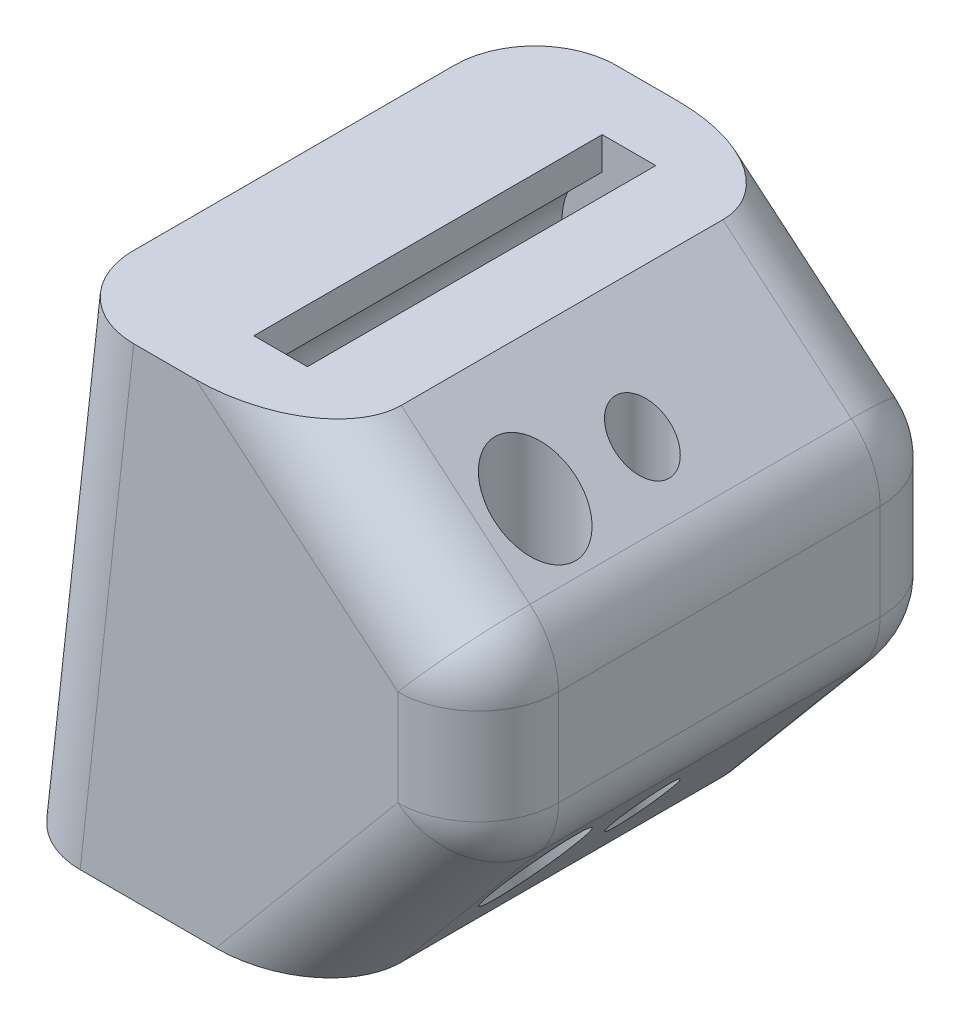
ISO-10303-21;
HEADER;
FILE_DESCRIPTION(('STEP AP214'),'2;1');
FILE_NAME('part.step','',(''),(''),'','','');
FILE_SCHEMA(('AUTOMOTIVE_DESIGN { 1 0 10303 214 1 1 1 1 }'));
ENDSEC;
DATA;
#1=APPLICATION_CONTEXT('core data for automotive mechanical design processes');
#2=APPLICATION_PROTOCOL_DEFINITION('international standard','automotive_design',2000,#1);
#3=PRODUCT_CONTEXT('',#1,'mechanical');
#4=PRODUCT('Part','Part','',(#3));
#5=PRODUCT_RELATED_PRODUCT_CATEGORY('part','',(#4));
#6=PRODUCT_DEFINITION_FORMATION('','',#4);
#7=PRODUCT_DEFINITION_CONTEXT('part definition',#1,'design');
#8=PRODUCT_DEFINITION('design','',#6,#7);
#9=PRODUCT_DEFINITION_SHAPE('','',#8);
#10=(LENGTH_UNIT() NAMED_UNIT(*) SI_UNIT(.MILLI.,.METRE.));
#11=(NAMED_UNIT(*) PLANE_ANGLE_UNIT() SI_UNIT($,.RADIAN.));
#12=(NAMED_UNIT(*) SI_UNIT($,.STERADIAN.) SOLID_ANGLE_UNIT());
#13=UNCERTAINTY_MEASURE_WITH_UNIT(LENGTH_MEASURE(1.E-05),#10,'distance_accuracy_value','');
#14=(GEOMETRIC_REPRESENTATION_CONTEXT(3) GLOBAL_UNCERTAINTY_ASSIGNED_CONTEXT((#13)) GLOBAL_UNIT_ASSIGNED_CONTEXT((#10,
#11,#12)) REPRESENTATION_CONTEXT('',''));
#15=CARTESIAN_POINT('',(0.,0.,0.));
#16=DIRECTION('',(0.,0.,1.));
#17=DIRECTION('',(1.,0.,0.));
#18=AXIS2_PLACEMENT_3D('',#15,#16,#17);
#19=CARTESIAN_POINT('',(0.,0.,18.));
#20=DIRECTION('',(0.,1.,0.));
#21=DIRECTION('',(0.,0.,1.));
#22=AXIS2_PLACEMENT_3D('',#19,#20,#21);
#23=PLANE('',#22);
#24=DIRECTION('',(1.,0.,0.));
#25=VECTOR('',#24,1.);
#26=CARTESIAN_POINT('',(0.,0.,0.));
#27=LINE('',#26,#25);
#28=CARTESIAN_POINT('',(3.01846171271247,0.,0.));
#29=VERTEX_POINT('',#28);
#30=CARTESIAN_POINT('',(8.08377813200317,0.,0.));
#31=VERTEX_POINT('',#30);
#32=EDGE_CURVE('E286',#29,#31,#27,.T.);
#33=ORIENTED_EDGE('',*,*,#32,.T.);
#34=CARTESIAN_POINT('',(8.08377813200317,0.,3.));
#35=DIRECTION('',(0.,1.,0.));
#36=DIRECTION('',(-1.,0.,0.));
#37=AXIS2_PLACEMENT_3D('',#34,#35,#36);
#38=ELLIPSE('',#37,3.91622186799683,3.);
#39=CARTESIAN_POINT('',(12.,0.,3.));
#40=VERTEX_POINT('',#39);
#41=EDGE_CURVE('E382',#31,#40,#38,.F.);
#42=ORIENTED_EDGE('',*,*,#41,.T.);
#43=DIRECTION('',(0.,0.,-1.));
#44=VECTOR('',#43,1.);
#45=CARTESIAN_POINT('',(12.,0.,18.));
#46=LINE('',#45,#44);
#47=CARTESIAN_POINT('',(12.,0.,15.));
#48=VERTEX_POINT('',#47);
#49=EDGE_CURVE('E336',#48,#40,#46,.T.);
#50=ORIENTED_EDGE('',*,*,#49,.F.);
#51=CARTESIAN_POINT('',(8.08377813200318,0.,15.));
#52=DIRECTION('',(0.,1.,0.));
#53=DIRECTION('',(1.,0.,0.));
#54=AXIS2_PLACEMENT_3D('',#51,#52,#53);
#55=ELLIPSE('',#54,3.91622186799683,3.);
#56=CARTESIAN_POINT('',(8.08377813200318,0.,18.));
#57=VERTEX_POINT('',#56);
#58=EDGE_CURVE('E379',#48,#57,#55,.F.);
#59=ORIENTED_EDGE('',*,*,#58,.T.);
#60=DIRECTION('',(1.,0.,0.));
#61=VECTOR('',#60,1.);
#62=CARTESIAN_POINT('',(0.,0.,18.));
#63=LINE('',#62,#61);
#64=CARTESIAN_POINT('',(3.01846171271247,0.,18.));
#65=VERTEX_POINT('',#64);
#66=EDGE_CURVE('E297',#65,#57,#63,.T.);
#67=ORIENTED_EDGE('',*,*,#66,.F.);
#68=CARTESIAN_POINT('',(3.01846171271247,0.,15.));
#69=DIRECTION('',(0.,1.,0.));
#70=DIRECTION('',(-1.,0.,0.));
#71=AXIS2_PLACEMENT_3D('',#68,#69,#70);
#72=ELLIPSE('',#71,3.01846171271247,3.);
#73=CARTESIAN_POINT('',(0.,0.,15.));
#74=VERTEX_POINT('',#73);
#75=EDGE_CURVE('E373',#65,#74,#72,.F.);
#76=ORIENTED_EDGE('',*,*,#75,.T.);
#77=DIRECTION('',(0.,0.,-1.));
#78=VECTOR('',#77,1.);
#79=CARTESIAN_POINT('',(0.,0.,18.));
#80=LINE('',#79,#78);
#81=CARTESIAN_POINT('',(0.,0.,3.));
#82=VERTEX_POINT('',#81);
#83=EDGE_CURVE('E340',#74,#82,#80,.T.);
#84=ORIENTED_EDGE('',*,*,#83,.T.);
#85=CARTESIAN_POINT('',(3.01846171271247,0.,3.));
#86=DIRECTION('',(0.,1.,0.));
#87=DIRECTION('',(1.,0.,0.));
#88=AXIS2_PLACEMENT_3D('',#85,#86,#87);
#89=ELLIPSE('',#88,3.01846171271247,3.);
#90=EDGE_CURVE('E376',#82,#29,#89,.F.);
#91=ORIENTED_EDGE('',*,*,#90,.T.);
#92=EDGE_LOOP('',(#33,#42,#50,#59,#67,#76,#84,#91));
#93=FACE_BOUND('',#92,.T.);
#94=DIRECTION('',(-1.,0.,0.));
#95=VECTOR('',#94,1.);
#96=CARTESIAN_POINT('',(9.,0.,15.5));
#97=LINE('',#96,#95);
#98=CARTESIAN_POINT('',(9.,0.,15.5));
#99=VERTEX_POINT('',#98);
#100=CARTESIAN_POINT('',(7.,0.,15.5));
#101=VERTEX_POINT('',#100);
#102=EDGE_CURVE('E215',#99,#101,#97,.T.);
#103=ORIENTED_EDGE('',*,*,#102,.F.);
#104=DIRECTION('',(0.,0.,-1.));
#105=VECTOR('',#104,1.);
#106=CARTESIAN_POINT('',(9.,0.,15.5));
#107=LINE('',#106,#105);
#108=CARTESIAN_POINT('',(9.,0.,2.5));
#109=VERTEX_POINT('',#108);
#110=EDGE_CURVE('E205',#99,#109,#107,.T.);
#111=ORIENTED_EDGE('',*,*,#110,.T.);
#112=DIRECTION('',(-1.,0.,0.));
#113=VECTOR('',#112,1.);
#114=CARTESIAN_POINT('',(9.,0.,2.5));
#115=LINE('',#114,#113);
#116=CARTESIAN_POINT('',(7.,0.,2.5));
#117=VERTEX_POINT('',#116);
#118=EDGE_CURVE('E224',#109,#117,#115,.T.);
#119=ORIENTED_EDGE('',*,*,#118,.T.);
#120=DIRECTION('',(0.,0.,-1.));
#121=VECTOR('',#120,1.);
#122=CARTESIAN_POINT('',(7.,0.,15.5));
#123=LINE('',#122,#121);
#124=EDGE_CURVE('E246',#101,#117,#123,.T.);
#125=ORIENTED_EDGE('',*,*,#124,.F.);
#126=EDGE_LOOP('',(#103,#111,#119,#125));
#127=FACE_BOUND('',#126,.T.);
#128=ADVANCED_FACE('F39',(#93,#127),#23,.F.);
#129=CARTESIAN_POINT('',(2.,18.,18.));
#130=DIRECTION('',(0.,-1.,0.));
#131=DIRECTION('',(0.,0.,-1.));
#132=AXIS2_PLACEMENT_3D('',#129,#130,#131);
#133=PLANE('',#132);
#134=DIRECTION('',(0.,0.,-1.));
#135=VECTOR('',#134,1.);
#136=CARTESIAN_POINT('',(12.,18.,18.));
#137=LINE('',#136,#135);
#138=CARTESIAN_POINT('',(12.,18.,15.));
#139=VERTEX_POINT('',#138);
#140=CARTESIAN_POINT('',(12.,18.,3.));
#141=VERTEX_POINT('',#140);
#142=EDGE_CURVE('E316',#139,#141,#137,.T.);
#143=ORIENTED_EDGE('',*,*,#142,.T.);
#144=CARTESIAN_POINT('',(7.33282851941877,18.,3.));
#145=DIRECTION('',(0.,-1.,0.));
#146=DIRECTION('',(1.,0.,0.));
#147=AXIS2_PLACEMENT_3D('',#144,#145,#146);
#148=ELLIPSE('',#147,4.66717148058123,3.);
#149=CARTESIAN_POINT('',(7.33282851941877,18.,0.));
#150=VERTEX_POINT('',#149);
#151=EDGE_CURVE('E406',#141,#150,#148,.F.);
#152=ORIENTED_EDGE('',*,*,#151,.T.);
#153=DIRECTION('',(-1.,0.,0.));
#154=VECTOR('',#153,1.);
#155=CARTESIAN_POINT('',(2.,18.,0.));
#156=LINE('',#155,#154);
#157=CARTESIAN_POINT('',(5.01846171271247,18.,0.));
#158=VERTEX_POINT('',#157);
#159=EDGE_CURVE('E302',#150,#158,#156,.T.);
#160=ORIENTED_EDGE('',*,*,#159,.T.);
#161=CARTESIAN_POINT('',(5.01846171271247,18.,3.));
#162=DIRECTION('',(0.,-1.,0.));
#163=DIRECTION('',(1.,0.,0.));
#164=AXIS2_PLACEMENT_3D('',#161,#162,#163);
#165=ELLIPSE('',#164,3.01846171271247,3.);
#166=CARTESIAN_POINT('',(2.,18.,3.));
#167=VERTEX_POINT('',#166);
#168=EDGE_CURVE('E400',#158,#167,#165,.F.);
#169=ORIENTED_EDGE('',*,*,#168,.T.);
#170=DIRECTION('',(0.,0.,-1.));
#171=VECTOR('',#170,1.);
#172=CARTESIAN_POINT('',(2.,18.,18.));
#173=LINE('',#172,#171);
#174=CARTESIAN_POINT('',(2.,18.,15.));
#175=VERTEX_POINT('',#174);
#176=EDGE_CURVE('E306',#175,#167,#173,.T.);
#177=ORIENTED_EDGE('',*,*,#176,.F.);
#178=CARTESIAN_POINT('',(5.01846171271247,18.,15.));
#179=DIRECTION('',(0.,-1.,0.));
#180=DIRECTION('',(-1.,0.,0.));
#181=AXIS2_PLACEMENT_3D('',#178,#179,#180);
#182=ELLIPSE('',#181,3.01846171271247,3.);
#183=CARTESIAN_POINT('',(5.01846171271247,18.,18.));
#184=VERTEX_POINT('',#183);
#185=EDGE_CURVE('E397',#175,#184,#182,.F.);
#186=ORIENTED_EDGE('',*,*,#185,.T.);
#187=DIRECTION('',(-1.,0.,0.));
#188=VECTOR('',#187,1.);
#189=CARTESIAN_POINT('',(2.,18.,18.));
#190=LINE('',#189,#188);
#191=CARTESIAN_POINT('',(7.33282851941876,18.,18.));
#192=VERTEX_POINT('',#191);
#193=EDGE_CURVE('E301',#192,#184,#190,.T.);
#194=ORIENTED_EDGE('',*,*,#193,.F.);
#195=CARTESIAN_POINT('',(7.33282851941876,18.,15.));
#196=DIRECTION('',(0.,-1.,0.));
#197=DIRECTION('',(-1.,0.,0.));
#198=AXIS2_PLACEMENT_3D('',#195,#196,#197);
#199=ELLIPSE('',#198,4.66717148058123,3.);
#200=EDGE_CURVE('E403',#192,#139,#199,.F.);
#201=ORIENTED_EDGE('',*,*,#200,.T.);
#202=EDGE_LOOP('',(#143,#152,#160,#169,#177,#186,#194,#201));
#203=FACE_BOUND('',#202,.T.);
#204=DIRECTION('',(-1.,0.,0.));
#205=VECTOR('',#204,1.);
#206=CARTESIAN_POINT('',(7.,18.,2.5));
#207=LINE('',#206,#205);
#208=CARTESIAN_POINT('',(9.,18.,2.5));
#209=VERTEX_POINT('',#208);
#210=CARTESIAN_POINT('',(7.,18.,2.5));
#211=VERTEX_POINT('',#210);
#212=EDGE_CURVE('E261',#209,#211,#207,.T.);
#213=ORIENTED_EDGE('',*,*,#212,.F.);
#214=DIRECTION('',(0.,0.,1.));
#215=VECTOR('',#214,1.);
#216=CARTESIAN_POINT('',(9.,18.,2.5));
#217=LINE('',#216,#215);
#218=CARTESIAN_POINT('',(9.,18.,15.5));
#219=VERTEX_POINT('',#218);
#220=EDGE_CURVE('E291',#209,#219,#217,.T.);
#221=ORIENTED_EDGE('',*,*,#220,.T.);
#222=DIRECTION('',(-1.,0.,0.));
#223=VECTOR('',#222,1.);
#224=CARTESIAN_POINT('',(7.,18.,15.5));
#225=LINE('',#224,#223);
#226=CARTESIAN_POINT('',(7.,18.,15.5));
#227=VERTEX_POINT('',#226);
#228=EDGE_CURVE('E276',#219,#227,#225,.T.);
#229=ORIENTED_EDGE('',*,*,#228,.T.);
#230=DIRECTION('',(0.,0.,1.));
#231=VECTOR('',#230,1.);
#232=CARTESIAN_POINT('',(7.,18.,2.5));
#233=LINE('',#232,#231);
#234=EDGE_CURVE('E287',#211,#227,#233,.T.);
#235=ORIENTED_EDGE('',*,*,#234,.F.);
#236=EDGE_LOOP('',(#213,#221,#229,#235));
#237=FACE_BOUND('',#236,.T.);
#238=ADVANCED_FACE('F474',(#203,#237),#133,.F.);
#239=CARTESIAN_POINT('',(0.,0.,18.));
#240=DIRECTION('',(0.993883734673619,-0.110431526074846,0.));
#241=DIRECTION('',(0.110431526074846,0.993883734673619,0.));
#242=AXIS2_PLACEMENT_3D('',#239,#240,#241);
#243=PLANE('',#242);
#244=ORIENTED_EDGE('',*,*,#176,.T.);
#245=DIRECTION('',(-0.110431526074846,-0.993883734673619,0.));
#246=VECTOR('',#245,1.);
#247=CARTESIAN_POINT('',(0.,0.,3.));
#248=LINE('',#247,#246);
#249=EDGE_CURVE('E430',#167,#82,#248,.T.);
#250=ORIENTED_EDGE('',*,*,#249,.T.);
#251=ORIENTED_EDGE('',*,*,#83,.F.);
#252=DIRECTION('',(-0.110431526074846,-0.993883734673619,0.));
#253=VECTOR('',#252,1.);
#254=CARTESIAN_POINT('',(0.,0.,15.));
#255=LINE('',#254,#253);
#256=EDGE_CURVE('E427',#74,#175,#255,.F.);
#257=ORIENTED_EDGE('',*,*,#256,.T.);
#258=EDGE_LOOP('',(#244,#250,#251,#257));
#259=FACE_BOUND('',#258,.T.);
#260=ADVANCED_FACE('F508',(#259),#243,.F.);
#261=CARTESIAN_POINT('',(12.,0.,18.));
#262=DIRECTION('',(-0.76604444311898,0.642787609686537,0.));
#263=DIRECTION('',(-0.642787609686537,-0.76604444311898,0.));
#264=AXIS2_PLACEMENT_3D('',#261,#262,#263);
#265=PLANE('',#264);
#266=CARTESIAN_POINT('',(15.,3.57526077778265,9.));
#267=DIRECTION('',(-0.76604444311898,0.642787609686537,0.));
#268=DIRECTION('',(-0.642787609686537,-0.76604444311898,0.));
#269=AXIS2_PLACEMENT_3D('',#266,#267,#268);
#270=ELLIPSE('',#269,1.55572382686042,1.);
#271=CARTESIAN_POINT('',(14.,2.38350718518843,9.));
#272=VERTEX_POINT('',#271);
#273=EDGE_CURVE('E227',#272,#272,#270,.F.);
#274=ORIENTED_EDGE('',*,*,#273,.F.);
#275=EDGE_LOOP('',(#274));
#276=FACE_BOUND('',#275,.T.);
#277=CARTESIAN_POINT('',(15.,3.57526077778265,13.));
#278=DIRECTION('',(-0.76604444311898,0.642787609686537,0.));
#279=DIRECTION('',(-0.642787609686537,-0.76604444311898,0.));
#280=AXIS2_PLACEMENT_3D('',#277,#278,#279);
#281=ELLIPSE('',#280,2.33358574029063,1.5);
#282=CARTESIAN_POINT('',(13.5,1.78763038889132,13.));
#283=VERTEX_POINT('',#282);
#284=EDGE_CURVE('E349',#283,#283,#281,.F.);
#285=ORIENTED_EDGE('',*,*,#284,.F.);
#286=EDGE_LOOP('',(#285));
#287=FACE_BOUND('',#286,.T.);
#288=ORIENTED_EDGE('',*,*,#49,.T.);
#289=DIRECTION('',(0.642787609686537,0.76604444311898,0.));
#290=VECTOR('',#289,1.);
#291=CARTESIAN_POINT('',(17.1718307475979,6.16354787373898,3.));
#292=LINE('',#291,#290);
#293=CARTESIAN_POINT('',(17.1718307475979,6.16354787373898,3.));
#294=VERTEX_POINT('',#293);
#295=EDGE_CURVE('E357',#40,#294,#292,.T.);
#296=ORIENTED_EDGE('',*,*,#295,.T.);
#297=DIRECTION('',(0.,0.,-1.));
#298=VECTOR('',#297,1.);
#299=CARTESIAN_POINT('',(17.1718307475979,6.16354787373898,18.));
#300=LINE('',#299,#298);
#301=CARTESIAN_POINT('',(17.1718307475979,6.16354787373898,15.));
#302=VERTEX_POINT('',#301);
#303=EDGE_CURVE('E332',#302,#294,#300,.T.);
#304=ORIENTED_EDGE('',*,*,#303,.F.);
#305=DIRECTION('',(0.642787609686537,0.76604444311898,0.));
#306=VECTOR('',#305,1.);
#307=CARTESIAN_POINT('',(12.,0.,15.));
#308=LINE('',#307,#306);
#309=EDGE_CURVE('E344',#302,#48,#308,.F.);
#310=ORIENTED_EDGE('',*,*,#309,.T.);
#311=EDGE_LOOP('',(#288,#296,#304,#310));
#312=FACE_BOUND('',#311,.T.);
#313=ADVANCED_FACE('F512',(#276,#287,#312),#265,.F.);
#314=CARTESIAN_POINT('',(14.8736974182409,8.0919107027986,18.));
#315=DIRECTION('',(0.,0.,-1.));
#316=DIRECTION('',(-1.,0.,0.));
#317=AXIS2_PLACEMENT_3D('',#314,#315,#316);
#318=CYLINDRICAL_SURFACE('',#317,3.);
#319=ORIENTED_EDGE('',*,*,#303,.T.);
#320=CARTESIAN_POINT('',(14.8736974182409,8.0919107027986,3.));
#321=DIRECTION('',(0.,0.,-1.));
#322=DIRECTION('',(-1.,0.,0.));
#323=AXIS2_PLACEMENT_3D('',#320,#321,#322);
#324=CIRCLE('',#323,3.);
#325=CARTESIAN_POINT('',(17.8736974182409,8.0919107027986,3.));
#326=VERTEX_POINT('',#325);
#327=EDGE_CURVE('E388',#294,#326,#324,.F.);
#328=ORIENTED_EDGE('',*,*,#327,.T.);
#329=DIRECTION('',(0.,0.,-1.));
#330=VECTOR('',#329,1.);
#331=CARTESIAN_POINT('',(17.8736974182409,8.0919107027986,18.));
#332=LINE('',#331,#330);
#333=CARTESIAN_POINT('',(17.8736974182409,8.0919107027986,15.));
#334=VERTEX_POINT('',#333);
#335=EDGE_CURVE('E328',#334,#326,#332,.T.);
#336=ORIENTED_EDGE('',*,*,#335,.F.);
#337=CARTESIAN_POINT('',(14.8736974182409,8.0919107027986,15.));
#338=DIRECTION('',(0.,0.,-1.));
#339=DIRECTION('',(-1.,0.,0.));
#340=AXIS2_PLACEMENT_3D('',#337,#338,#339);
#341=CIRCLE('',#340,3.);
#342=EDGE_CURVE('E385',#334,#302,#341,.T.);
#343=ORIENTED_EDGE('',*,*,#342,.T.);
#344=EDGE_LOOP('',(#319,#328,#336,#343));
#345=FACE_BOUND('',#344,.T.);
#346=ADVANCED_FACE('F764',(#345),#318,.T.);
#347=CARTESIAN_POINT('',(17.8736974182409,11.6724596882421,18.));
#348=DIRECTION('',(-1.,0.,0.));
#349=DIRECTION('',(0.,-1.,0.));
#350=AXIS2_PLACEMENT_3D('',#347,#348,#349);
#351=PLANE('',#350);
#352=ORIENTED_EDGE('',*,*,#335,.T.);
#353=DIRECTION('',(0.,1.,0.));
#354=VECTOR('',#353,1.);
#355=CARTESIAN_POINT('',(17.8736974182409,11.6724596882421,3.));
#356=LINE('',#355,#354);
#357=CARTESIAN_POINT('',(17.8736974182409,11.6724596882421,3.));
#358=VERTEX_POINT('',#357);
#359=EDGE_CURVE('E11',#326,#358,#356,.T.);
#360=ORIENTED_EDGE('',*,*,#359,.T.);
#361=DIRECTION('',(0.,0.,-1.));
#362=VECTOR('',#361,1.);
#363=CARTESIAN_POINT('',(17.8736974182409,11.6724596882421,18.));
#364=LINE('',#363,#362);
#365=CARTESIAN_POINT('',(17.8736974182409,11.6724596882421,15.));
#366=VERTEX_POINT('',#365);
#367=EDGE_CURVE('E324',#366,#358,#364,.T.);
#368=ORIENTED_EDGE('',*,*,#367,.F.);
#369=DIRECTION('',(0.,1.,0.));
#370=VECTOR('',#369,1.);
#371=CARTESIAN_POINT('',(17.8736974182409,11.6724596882421,15.));
#372=LINE('',#371,#370);
#373=EDGE_CURVE('E49',#366,#334,#372,.F.);
#374=ORIENTED_EDGE('',*,*,#373,.T.);
#375=EDGE_LOOP('',(#352,#360,#368,#374));
#376=FACE_BOUND('',#375,.T.);
#377=ADVANCED_FACE('F755',(#376),#351,.F.);
#378=CARTESIAN_POINT('',(14.8736974182409,11.6724596882421,18.));
#379=DIRECTION('',(0.,0.,-1.));
#380=DIRECTION('',(-1.,0.,0.));
#381=AXIS2_PLACEMENT_3D('',#378,#379,#380);
#382=CYLINDRICAL_SURFACE('',#381,3.);
#383=ORIENTED_EDGE('',*,*,#367,.T.);
#384=CARTESIAN_POINT('',(14.8736974182409,11.6724596882421,3.));
#385=DIRECTION('',(0.,0.,-1.));
#386=DIRECTION('',(-1.,0.,0.));
#387=AXIS2_PLACEMENT_3D('',#384,#385,#386);
#388=CIRCLE('',#387,3.);
#389=CARTESIAN_POINT('',(16.8020602473005,13.970593017599,3.));
#390=VERTEX_POINT('',#389);
#391=EDGE_CURVE('E412',#358,#390,#388,.F.);
#392=ORIENTED_EDGE('',*,*,#391,.T.);
#393=DIRECTION('',(0.,0.,-1.));
#394=VECTOR('',#393,1.);
#395=CARTESIAN_POINT('',(16.8020602473005,13.970593017599,18.));
#396=LINE('',#395,#394);
#397=CARTESIAN_POINT('',(16.8020602473005,13.970593017599,15.));
#398=VERTEX_POINT('',#397);
#399=EDGE_CURVE('E320',#398,#390,#396,.T.);
#400=ORIENTED_EDGE('',*,*,#399,.F.);
#401=CARTESIAN_POINT('',(14.8736974182409,11.6724596882421,15.));
#402=DIRECTION('',(0.,0.,-1.));
#403=DIRECTION('',(-1.,0.,0.));
#404=AXIS2_PLACEMENT_3D('',#401,#402,#403);
#405=CIRCLE('',#404,3.);
#406=EDGE_CURVE('E409',#398,#366,#405,.T.);
#407=ORIENTED_EDGE('',*,*,#406,.T.);
#408=EDGE_LOOP('',(#383,#392,#400,#407));
#409=FACE_BOUND('',#408,.T.);
#410=ADVANCED_FACE('F746',(#409),#382,.T.);
#411=CARTESIAN_POINT('',(12.,18.,18.));
#412=DIRECTION('',(-0.64278760968654,-0.766044443118978,0.));
#413=DIRECTION('',(0.766044443118978,-0.64278760968654,0.));
#414=AXIS2_PLACEMENT_3D('',#411,#412,#413);
#415=PLANE('',#414);
#416=CARTESIAN_POINT('',(15.,15.4827011064682,9.));
#417=DIRECTION('',(-0.64278760968654,-0.766044443118978,0.));
#418=DIRECTION('',(0.766044443118978,-0.64278760968654,0.));
#419=AXIS2_PLACEMENT_3D('',#416,#417,#418);
#420=ELLIPSE('',#419,1.30540728933228,1.);
#421=CARTESIAN_POINT('',(16.,14.6436014752909,9.));
#422=VERTEX_POINT('',#421);
#423=EDGE_CURVE('E351',#422,#422,#420,.F.);
#424=ORIENTED_EDGE('',*,*,#423,.F.);
#425=EDGE_LOOP('',(#424));
#426=FACE_BOUND('',#425,.T.);
#427=CARTESIAN_POINT('',(15.,15.4827011064682,13.));
#428=DIRECTION('',(-0.64278760968654,-0.766044443118978,0.));
#429=DIRECTION('',(0.766044443118978,-0.64278760968654,0.));
#430=AXIS2_PLACEMENT_3D('',#427,#428,#429);
#431=ELLIPSE('',#430,1.95811093399842,1.5);
#432=CARTESIAN_POINT('',(16.5,14.2240516597022,13.));
#433=VERTEX_POINT('',#432);
#434=EDGE_CURVE('E345',#433,#433,#431,.F.);
#435=ORIENTED_EDGE('',*,*,#434,.F.);
#436=EDGE_LOOP('',(#435));
#437=FACE_BOUND('',#436,.T.);
#438=ORIENTED_EDGE('',*,*,#399,.T.);
#439=DIRECTION('',(-0.766044443118978,0.64278760968654,0.));
#440=VECTOR('',#439,1.);
#441=CARTESIAN_POINT('',(12.,18.,3.));
#442=LINE('',#441,#440);
#443=EDGE_CURVE('E394',#390,#141,#442,.T.);
#444=ORIENTED_EDGE('',*,*,#443,.T.);
#445=ORIENTED_EDGE('',*,*,#142,.F.);
#446=DIRECTION('',(-0.766044443118978,0.64278760968654,0.));
#447=VECTOR('',#446,1.);
#448=CARTESIAN_POINT('',(12.,18.,15.));
#449=LINE('',#448,#447);
#450=EDGE_CURVE('E391',#139,#398,#449,.F.);
#451=ORIENTED_EDGE('',*,*,#450,.T.);
#452=EDGE_LOOP('',(#438,#444,#445,#451));
#453=FACE_BOUND('',#452,.T.);
#454=ADVANCED_FACE('F738',(#426,#437,#453),#415,.F.);
#455=CARTESIAN_POINT('',(14.8736974182409,11.6724596882421,18.));
#456=DIRECTION('',(0.,0.,-1.));
#457=DIRECTION('',(-1.,0.,0.));
#458=AXIS2_PLACEMENT_3D('',#455,#456,#457);
#459=PLANE('',#458);
#460=ORIENTED_EDGE('',*,*,#193,.T.);
#461=DIRECTION('',(-0.110431526074846,-0.993883734673619,0.));
#462=VECTOR('',#461,1.);
#463=CARTESIAN_POINT('',(4.44416138222109,12.8312970255776,18.));
#464=LINE('',#463,#462);
#465=EDGE_CURVE('E423',#184,#65,#464,.T.);
#466=ORIENTED_EDGE('',*,*,#465,.T.);
#467=ORIENTED_EDGE('',*,*,#66,.T.);
#468=DIRECTION('',(0.642787609686537,0.76604444311898,0.));
#469=VECTOR('',#468,1.);
#470=CARTESIAN_POINT('',(16.6367736186933,10.1930630987051,18.));
#471=LINE('',#470,#469);
#472=CARTESIAN_POINT('',(14.8736974182409,8.0919107027986,18.));
#473=VERTEX_POINT('',#472);
#474=EDGE_CURVE('E420',#57,#473,#471,.T.);
#475=ORIENTED_EDGE('',*,*,#474,.T.);
#476=DIRECTION('',(0.,1.,0.));
#477=VECTOR('',#476,1.);
#478=CARTESIAN_POINT('',(14.8736974182409,11.6724596882421,18.));
#479=LINE('',#478,#477);
#480=CARTESIAN_POINT('',(14.8736974182409,11.6724596882421,18.));
#481=VERTEX_POINT('',#480);
#482=EDGE_CURVE('E57',#473,#481,#479,.T.);
#483=ORIENTED_EDGE('',*,*,#482,.T.);
#484=DIRECTION('',(-0.766044443118978,0.64278760968654,0.));
#485=VECTOR('',#484,1.);
#486=CARTESIAN_POINT('',(14.8736974182409,11.6724596882421,18.));
#487=LINE('',#486,#485);
#488=EDGE_CURVE('E417',#481,#192,#487,.T.);
#489=ORIENTED_EDGE('',*,*,#488,.T.);
#490=EDGE_LOOP('',(#460,#466,#467,#475,#483,#489));
#491=FACE_BOUND('',#490,.T.);
#492=ADVANCED_FACE('F471',(#491),#459,.F.);
#493=CARTESIAN_POINT('',(14.8736974182409,11.6724596882421,0.));
#494=DIRECTION('',(0.,0.,-1.));
#495=DIRECTION('',(-1.,0.,0.));
#496=AXIS2_PLACEMENT_3D('',#493,#494,#495);
#497=PLANE('',#496);
#498=ORIENTED_EDGE('',*,*,#32,.F.);
#499=DIRECTION('',(-0.110431526074846,-0.993883734673619,0.));
#500=VECTOR('',#499,1.);
#501=CARTESIAN_POINT('',(4.98165120402085,17.6687054217755,0.));
#502=LINE('',#501,#500);
#503=EDGE_CURVE('E370',#29,#158,#502,.F.);
#504=ORIENTED_EDGE('',*,*,#503,.T.);
#505=ORIENTED_EDGE('',*,*,#159,.F.);
#506=DIRECTION('',(-0.766044443118978,0.64278760968654,0.));
#507=VECTOR('',#506,1.);
#508=CARTESIAN_POINT('',(14.8736974182409,11.6724596882421,0.));
#509=LINE('',#508,#507);
#510=CARTESIAN_POINT('',(14.8736974182409,11.6724596882421,0.));
#511=VERTEX_POINT('',#510);
#512=EDGE_CURVE('E364',#150,#511,#509,.F.);
#513=ORIENTED_EDGE('',*,*,#512,.T.);
#514=DIRECTION('',(0.,1.,0.));
#515=VECTOR('',#514,1.);
#516=CARTESIAN_POINT('',(14.8736974182409,8.09191070279861,0.));
#517=LINE('',#516,#515);
#518=CARTESIAN_POINT('',(14.8736974182409,8.0919107027986,0.));
#519=VERTEX_POINT('',#518);
#520=EDGE_CURVE('E361',#511,#519,#517,.F.);
#521=ORIENTED_EDGE('',*,*,#520,.T.);
#522=DIRECTION('',(0.642787609686537,0.76604444311898,0.));
#523=VECTOR('',#522,1.);
#524=CARTESIAN_POINT('',(9.70186667064306,1.92836282905961,0.));
#525=LINE('',#524,#523);
#526=EDGE_CURVE('E367',#519,#31,#525,.F.);
#527=ORIENTED_EDGE('',*,*,#526,.T.);
#528=EDGE_LOOP('',(#498,#504,#505,#513,#521,#527));
#529=FACE_BOUND('',#528,.T.);
#530=ADVANCED_FACE('F717',(#529),#497,.T.);
#531=CARTESIAN_POINT('',(8.,14.5,2.5));
#532=DIRECTION('',(0.,0.,1.));
#533=DIRECTION('',(1.,0.,0.));
#534=AXIS2_PLACEMENT_3D('',#531,#532,#533);
#535=CYLINDRICAL_SURFACE('',#534,2.5);
#536=CARTESIAN_POINT('',(8.,14.5,15.5));
#537=DIRECTION('',(0.,0.,1.));
#538=DIRECTION('',(1.,0.,0.));
#539=AXIS2_PLACEMENT_3D('',#536,#537,#538);
#540=CIRCLE('',#539,2.5);
#541=CARTESIAN_POINT('',(7.,16.7912878474779,15.5));
#542=VERTEX_POINT('',#541);
#543=CARTESIAN_POINT('',(9.,16.7912878474779,15.5));
#544=VERTEX_POINT('',#543);
#545=EDGE_CURVE('E245',#542,#544,#540,.T.);
#546=ORIENTED_EDGE('',*,*,#545,.T.);
#547=DIRECTION('',(0.,0.,1.));
#548=VECTOR('',#547,1.);
#549=CARTESIAN_POINT('',(9.,16.7912878474779,2.5));
#550=LINE('',#549,#548);
#551=CARTESIAN_POINT('',(9.,16.7912878474779,2.5));
#552=VERTEX_POINT('',#551);
#553=EDGE_CURVE('E268',#552,#544,#550,.T.);
#554=ORIENTED_EDGE('',*,*,#553,.F.);
#555=CARTESIAN_POINT('',(8.,14.5,2.5));
#556=DIRECTION('',(0.,0.,1.));
#557=DIRECTION('',(1.,0.,0.));
#558=AXIS2_PLACEMENT_3D('',#555,#556,#557);
#559=CIRCLE('',#558,2.5);
#560=CARTESIAN_POINT('',(7.,16.7912878474779,2.5));
#561=VERTEX_POINT('',#560);
#562=EDGE_CURVE('E252',#561,#552,#559,.T.);
#563=ORIENTED_EDGE('',*,*,#562,.F.);
#564=DIRECTION('',(0.,0.,1.));
#565=VECTOR('',#564,1.);
#566=CARTESIAN_POINT('',(7.,16.7912878474779,2.5));
#567=LINE('',#566,#565);
#568=EDGE_CURVE('E283',#561,#542,#567,.T.);
#569=ORIENTED_EDGE('',*,*,#568,.T.);
#570=EDGE_LOOP('',(#546,#554,#563,#569));
#571=FACE_BOUND('',#570,.T.);
#572=ADVANCED_FACE('F708',(#571),#535,.F.);
#573=CARTESIAN_POINT('',(7.,18.,2.5));
#574=DIRECTION('',(-1.,0.,0.));
#575=DIRECTION('',(0.,-1.,0.));
#576=AXIS2_PLACEMENT_3D('',#573,#574,#575);
#577=PLANE('',#576);
#578=DIRECTION('',(0.,-1.,0.));
#579=VECTOR('',#578,1.);
#580=CARTESIAN_POINT('',(7.,18.,15.5));
#581=LINE('',#580,#579);
#582=EDGE_CURVE('E257',#227,#542,#581,.T.);
#583=ORIENTED_EDGE('',*,*,#582,.T.);
#584=ORIENTED_EDGE('',*,*,#568,.F.);
#585=DIRECTION('',(0.,-1.,0.));
#586=VECTOR('',#585,1.);
#587=CARTESIAN_POINT('',(7.,18.,2.5));
#588=LINE('',#587,#586);
#589=EDGE_CURVE('E264',#211,#561,#588,.T.);
#590=ORIENTED_EDGE('',*,*,#589,.F.);
#591=ORIENTED_EDGE('',*,*,#234,.T.);
#592=EDGE_LOOP('',(#583,#584,#590,#591));
#593=FACE_BOUND('',#592,.T.);
#594=ADVANCED_FACE('F699',(#593),#577,.F.);
#595=CARTESIAN_POINT('',(9.,18.,2.5));
#596=DIRECTION('',(1.,0.,0.));
#597=DIRECTION('',(0.,0.,-1.));
#598=AXIS2_PLACEMENT_3D('',#595,#596,#597);
#599=PLANE('',#598);
#600=DIRECTION('',(0.,1.,0.));
#601=VECTOR('',#600,1.);
#602=CARTESIAN_POINT('',(9.,18.,15.5));
#603=LINE('',#602,#601);
#604=EDGE_CURVE('E272',#544,#219,#603,.T.);
#605=ORIENTED_EDGE('',*,*,#604,.T.);
#606=ORIENTED_EDGE('',*,*,#220,.F.);
#607=DIRECTION('',(0.,1.,0.));
#608=VECTOR('',#607,1.);
#609=CARTESIAN_POINT('',(9.,18.,2.5));
#610=LINE('',#609,#608);
#611=EDGE_CURVE('E256',#552,#209,#610,.T.);
#612=ORIENTED_EDGE('',*,*,#611,.F.);
#613=ORIENTED_EDGE('',*,*,#553,.T.);
#614=EDGE_LOOP('',(#605,#606,#612,#613));
#615=FACE_BOUND('',#614,.T.);
#616=ADVANCED_FACE('F690',(#615),#599,.F.);
#617=CARTESIAN_POINT('',(8.,14.5,2.5));
#618=DIRECTION('',(0.,0.,1.));
#619=DIRECTION('',(1.,0.,0.));
#620=AXIS2_PLACEMENT_3D('',#617,#618,#619);
#621=PLANE('',#620);
#622=ORIENTED_EDGE('',*,*,#562,.T.);
#623=ORIENTED_EDGE('',*,*,#611,.T.);
#624=ORIENTED_EDGE('',*,*,#212,.T.);
#625=ORIENTED_EDGE('',*,*,#589,.T.);
#626=EDGE_LOOP('',(#622,#623,#624,#625));
#627=FACE_BOUND('',#626,.T.);
#628=ADVANCED_FACE('F681',(#627),#621,.T.);
#629=CARTESIAN_POINT('',(8.,14.5,15.5));
#630=DIRECTION('',(0.,0.,1.));
#631=DIRECTION('',(1.,0.,0.));
#632=AXIS2_PLACEMENT_3D('',#629,#630,#631);
#633=PLANE('',#632);
#634=ORIENTED_EDGE('',*,*,#545,.F.);
#635=ORIENTED_EDGE('',*,*,#582,.F.);
#636=ORIENTED_EDGE('',*,*,#228,.F.);
#637=ORIENTED_EDGE('',*,*,#604,.F.);
#638=EDGE_LOOP('',(#634,#635,#636,#637));
#639=FACE_BOUND('',#638,.T.);
#640=ADVANCED_FACE('F668',(#639),#633,.F.);
#641=CARTESIAN_POINT('',(8.,3.5,15.5));
#642=DIRECTION('',(0.,0.,-1.));
#643=DIRECTION('',(-1.,0.,0.));
#644=AXIS2_PLACEMENT_3D('',#641,#642,#643);
#645=CYLINDRICAL_SURFACE('',#644,2.5);
#646=CARTESIAN_POINT('',(8.,3.5,2.5));
#647=DIRECTION('',(0.,0.,-1.));
#648=DIRECTION('',(-1.,0.,0.));
#649=AXIS2_PLACEMENT_3D('',#646,#647,#648);
#650=CIRCLE('',#649,2.5);
#651=CARTESIAN_POINT('',(7.,1.20871215252208,2.5));
#652=VERTEX_POINT('',#651);
#653=CARTESIAN_POINT('',(9.,1.20871215252208,2.5));
#654=VERTEX_POINT('',#653);
#655=EDGE_CURVE('E200',#652,#654,#650,.T.);
#656=ORIENTED_EDGE('',*,*,#655,.T.);
#657=DIRECTION('',(0.,0.,-1.));
#658=VECTOR('',#657,1.);
#659=CARTESIAN_POINT('',(9.,1.20871215252208,15.5));
#660=LINE('',#659,#658);
#661=CARTESIAN_POINT('',(9.,1.20871215252208,15.5));
#662=VERTEX_POINT('',#661);
#663=EDGE_CURVE('E193',#662,#654,#660,.T.);
#664=ORIENTED_EDGE('',*,*,#663,.F.);
#665=CARTESIAN_POINT('',(8.,3.5,15.5));
#666=DIRECTION('',(0.,0.,-1.));
#667=DIRECTION('',(-1.,0.,0.));
#668=AXIS2_PLACEMENT_3D('',#665,#666,#667);
#669=CIRCLE('',#668,2.5);
#670=CARTESIAN_POINT('',(7.,1.20871215252208,15.5));
#671=VERTEX_POINT('',#670);
#672=EDGE_CURVE('E197',#671,#662,#669,.T.);
#673=ORIENTED_EDGE('',*,*,#672,.F.);
#674=DIRECTION('',(0.,0.,-1.));
#675=VECTOR('',#674,1.);
#676=CARTESIAN_POINT('',(7.,1.20871215252208,15.5));
#677=LINE('',#676,#675);
#678=EDGE_CURVE('E242',#671,#652,#677,.T.);
#679=ORIENTED_EDGE('',*,*,#678,.T.);
#680=EDGE_LOOP('',(#656,#664,#673,#679));
#681=FACE_BOUND('',#680,.T.);
#682=ADVANCED_FACE('F195',(#681),#645,.F.);
#683=CARTESIAN_POINT('',(7.,0.,15.5));
#684=DIRECTION('',(-1.,0.,0.));
#685=DIRECTION('',(0.,0.,1.));
#686=AXIS2_PLACEMENT_3D('',#683,#684,#685);
#687=PLANE('',#686);
#688=DIRECTION('',(0.,1.,0.));
#689=VECTOR('',#688,1.);
#690=CARTESIAN_POINT('',(7.,0.,2.5));
#691=LINE('',#690,#689);
#692=EDGE_CURVE('E220',#117,#652,#691,.T.);
#693=ORIENTED_EDGE('',*,*,#692,.T.);
#694=ORIENTED_EDGE('',*,*,#678,.F.);
#695=DIRECTION('',(0.,1.,0.));
#696=VECTOR('',#695,1.);
#697=CARTESIAN_POINT('',(7.,0.,15.5));
#698=LINE('',#697,#696);
#699=EDGE_CURVE('E206',#101,#671,#698,.T.);
#700=ORIENTED_EDGE('',*,*,#699,.F.);
#701=ORIENTED_EDGE('',*,*,#124,.T.);
#702=EDGE_LOOP('',(#693,#694,#700,#701));
#703=FACE_BOUND('',#702,.T.);
#704=ADVANCED_FACE('F652',(#703),#687,.F.);
#705=CARTESIAN_POINT('',(9.,0.,15.5));
#706=DIRECTION('',(1.,0.,0.));
#707=DIRECTION('',(0.,0.,-1.));
#708=AXIS2_PLACEMENT_3D('',#705,#706,#707);
#709=PLANE('',#708);
#710=DIRECTION('',(0.,-1.,0.));
#711=VECTOR('',#710,1.);
#712=CARTESIAN_POINT('',(9.,0.,2.5));
#713=LINE('',#712,#711);
#714=EDGE_CURVE('E236',#654,#109,#713,.T.);
#715=ORIENTED_EDGE('',*,*,#714,.T.);
#716=ORIENTED_EDGE('',*,*,#110,.F.);
#717=DIRECTION('',(0.,-1.,0.));
#718=VECTOR('',#717,1.);
#719=CARTESIAN_POINT('',(9.,0.,15.5));
#720=LINE('',#719,#718);
#721=EDGE_CURVE('E209',#662,#99,#720,.T.);
#722=ORIENTED_EDGE('',*,*,#721,.F.);
#723=ORIENTED_EDGE('',*,*,#663,.T.);
#724=EDGE_LOOP('',(#715,#716,#722,#723));
#725=FACE_BOUND('',#724,.T.);
#726=ADVANCED_FACE('F210',(#725),#709,.F.);
#727=CARTESIAN_POINT('',(8.,3.5,15.5));
#728=DIRECTION('',(0.,0.,-1.));
#729=DIRECTION('',(-1.,0.,0.));
#730=AXIS2_PLACEMENT_3D('',#727,#728,#729);
#731=PLANE('',#730);
#732=ORIENTED_EDGE('',*,*,#672,.T.);
#733=ORIENTED_EDGE('',*,*,#721,.T.);
#734=ORIENTED_EDGE('',*,*,#102,.T.);
#735=ORIENTED_EDGE('',*,*,#699,.T.);
#736=EDGE_LOOP('',(#732,#733,#734,#735));
#737=FACE_BOUND('',#736,.T.);
#738=ADVANCED_FACE('F217',(#737),#731,.T.);
#739=CARTESIAN_POINT('',(8.,3.5,2.5));
#740=DIRECTION('',(0.,0.,-1.));
#741=DIRECTION('',(-1.,0.,0.));
#742=AXIS2_PLACEMENT_3D('',#739,#740,#741);
#743=PLANE('',#742);
#744=ORIENTED_EDGE('',*,*,#655,.F.);
#745=ORIENTED_EDGE('',*,*,#692,.F.);
#746=ORIENTED_EDGE('',*,*,#118,.F.);
#747=ORIENTED_EDGE('',*,*,#714,.F.);
#748=EDGE_LOOP('',(#744,#745,#746,#747));
#749=FACE_BOUND('',#748,.T.);
#750=ADVANCED_FACE('F628',(#749),#743,.F.);
#751=CARTESIAN_POINT('',(15.,25.,13.));
#752=DIRECTION('',(0.,-1.,0.));
#753=DIRECTION('',(0.,0.,-1.));
#754=AXIS2_PLACEMENT_3D('',#751,#752,#753);
#755=CYLINDRICAL_SURFACE('',#754,1.5);
#756=ORIENTED_EDGE('',*,*,#434,.T.);
#757=EDGE_LOOP('',(#756));
#758=FACE_BOUND('',#757,.T.);
#759=ORIENTED_EDGE('',*,*,#284,.T.);
#760=EDGE_LOOP('',(#759));
#761=FACE_BOUND('',#760,.T.);
#762=ADVANCED_FACE('F619',(#758,#761),#755,.F.);
#763=CARTESIAN_POINT('',(15.,25.,9.));
#764=DIRECTION('',(0.,-1.,0.));
#765=DIRECTION('',(0.,0.,-1.));
#766=AXIS2_PLACEMENT_3D('',#763,#764,#765);
#767=CYLINDRICAL_SURFACE('',#766,1.);
#768=ORIENTED_EDGE('',*,*,#423,.T.);
#769=EDGE_LOOP('',(#768));
#770=FACE_BOUND('',#769,.T.);
#771=ORIENTED_EDGE('',*,*,#273,.T.);
#772=EDGE_LOOP('',(#771));
#773=FACE_BOUND('',#772,.T.);
#774=ADVANCED_FACE('F536',(#770,#773),#767,.F.);
#775=CARTESIAN_POINT('',(10.0716371709404,15.7018666706431,3.));
#776=DIRECTION('',(0.766044443118978,-0.64278760968654,0.));
#777=DIRECTION('',(0.64278760968654,0.766044443118978,0.));
#778=AXIS2_PLACEMENT_3D('',#775,#776,#777);
#779=CYLINDRICAL_SURFACE('',#778,3.);
#780=ORIENTED_EDGE('',*,*,#151,.F.);
#781=ORIENTED_EDGE('',*,*,#443,.F.);
#782=CARTESIAN_POINT('',(14.8736974182409,11.6724596882421,3.));
#783=DIRECTION('',(0.766044443118978,-0.64278760968654,0.));
#784=DIRECTION('',(0.64278760968654,0.766044443118978,0.));
#785=AXIS2_PLACEMENT_3D('',#782,#783,#784);
#786=CIRCLE('',#785,3.);
#787=EDGE_CURVE('E350',#511,#390,#786,.T.);
#788=ORIENTED_EDGE('',*,*,#787,.F.);
#789=ORIENTED_EDGE('',*,*,#512,.F.);
#790=EDGE_LOOP('',(#780,#781,#788,#789));
#791=FACE_BOUND('',#790,.T.);
#792=ADVANCED_FACE('F532',(#791),#779,.T.);
#793=CARTESIAN_POINT('',(14.8736974182409,11.6724596882421,3.));
#794=DIRECTION('',(0.,0.,-1.));
#795=DIRECTION('',(-1.,0.,0.));
#796=AXIS2_PLACEMENT_3D('',#793,#794,#795);
#797=SPHERICAL_SURFACE('',#796,3.);
#798=ORIENTED_EDGE('',*,*,#787,.T.);
#799=ORIENTED_EDGE('',*,*,#391,.F.);
#800=CARTESIAN_POINT('',(14.8736974182409,11.6724596882421,3.));
#801=DIRECTION('',(0.,-1.,0.));
#802=DIRECTION('',(0.,0.,-1.));
#803=AXIS2_PLACEMENT_3D('',#800,#801,#802);
#804=CIRCLE('',#803,3.);
#805=EDGE_CURVE('E443',#511,#358,#804,.T.);
#806=ORIENTED_EDGE('',*,*,#805,.F.);
#807=EDGE_LOOP('',(#798,#799,#806));
#808=FACE_BOUND('',#807,.T.);
#809=ADVANCED_FACE('F528',(#808),#797,.T.);
#810=CARTESIAN_POINT('',(14.8736974182409,11.6724596882421,3.));
#811=DIRECTION('',(0.,-1.,0.));
#812=DIRECTION('',(1.,0.,0.));
#813=AXIS2_PLACEMENT_3D('',#810,#811,#812);
#814=CYLINDRICAL_SURFACE('',#813,3.);
#815=ORIENTED_EDGE('',*,*,#805,.T.);
#816=ORIENTED_EDGE('',*,*,#359,.F.);
#817=CARTESIAN_POINT('',(14.8736974182409,8.0919107027986,3.));
#818=DIRECTION('',(0.,-1.,0.));
#819=DIRECTION('',(0.,0.,-1.));
#820=AXIS2_PLACEMENT_3D('',#817,#818,#819);
#821=CIRCLE('',#820,3.);
#822=EDGE_CURVE('E439',#519,#326,#821,.T.);
#823=ORIENTED_EDGE('',*,*,#822,.F.);
#824=ORIENTED_EDGE('',*,*,#520,.F.);
#825=EDGE_LOOP('',(#815,#816,#823,#824));
#826=FACE_BOUND('',#825,.T.);
#827=ADVANCED_FACE('F524',(#826),#814,.T.);
#828=CARTESIAN_POINT('',(14.8736974182409,8.0919107027986,3.));
#829=DIRECTION('',(0.,0.,-1.));
#830=DIRECTION('',(-1.,0.,0.));
#831=AXIS2_PLACEMENT_3D('',#828,#829,#830);
#832=SPHERICAL_SURFACE('',#831,3.);
#833=ORIENTED_EDGE('',*,*,#822,.T.);
#834=ORIENTED_EDGE('',*,*,#327,.F.);
#835=CARTESIAN_POINT('',(14.8736974182409,8.0919107027986,3.));
#836=DIRECTION('',(-0.64278760968654,-0.766044443118977,0.));
#837=DIRECTION('',(0.766044443118977,-0.64278760968654,0.));
#838=AXIS2_PLACEMENT_3D('',#835,#836,#837);
#839=CIRCLE('',#838,3.);
#840=EDGE_CURVE('E436',#519,#294,#839,.T.);
#841=ORIENTED_EDGE('',*,*,#840,.F.);
#842=EDGE_LOOP('',(#833,#834,#841));
#843=FACE_BOUND('',#842,.T.);
#844=ADVANCED_FACE('F520',(#843),#832,.T.);
#845=CARTESIAN_POINT('',(9.70186667064306,1.92836282905961,3.));
#846=DIRECTION('',(-0.642787609686537,-0.76604444311898,0.));
#847=DIRECTION('',(0.76604444311898,-0.642787609686537,0.));
#848=AXIS2_PLACEMENT_3D('',#845,#846,#847);
#849=CYLINDRICAL_SURFACE('',#848,3.);
#850=ORIENTED_EDGE('',*,*,#41,.F.);
#851=ORIENTED_EDGE('',*,*,#526,.F.);
#852=ORIENTED_EDGE('',*,*,#840,.T.);
#853=ORIENTED_EDGE('',*,*,#295,.F.);
#854=EDGE_LOOP('',(#850,#851,#852,#853));
#855=FACE_BOUND('',#854,.T.);
#856=ADVANCED_FACE('F517',(#855),#849,.T.);
#857=CARTESIAN_POINT('',(14.8736974182409,11.6724596882421,15.));
#858=DIRECTION('',(-0.766044443118978,0.64278760968654,0.));
#859=DIRECTION('',(-0.64278760968654,-0.766044443118978,0.));
#860=AXIS2_PLACEMENT_3D('',#857,#858,#859);
#861=CYLINDRICAL_SURFACE('',#860,3.);
#862=CARTESIAN_POINT('',(14.8736974182409,11.6724596882421,15.));
#863=DIRECTION('',(0.766044443118978,-0.64278760968654,0.));
#864=DIRECTION('',(0.64278760968654,0.766044443118978,0.));
#865=AXIS2_PLACEMENT_3D('',#862,#863,#864);
#866=CIRCLE('',#865,3.);
#867=EDGE_CURVE('E43',#398,#481,#866,.T.);
#868=ORIENTED_EDGE('',*,*,#867,.F.);
#869=ORIENTED_EDGE('',*,*,#450,.F.);
#870=ORIENTED_EDGE('',*,*,#200,.F.);
#871=ORIENTED_EDGE('',*,*,#488,.F.);
#872=EDGE_LOOP('',(#868,#869,#870,#871));
#873=FACE_BOUND('',#872,.T.);
#874=ADVANCED_FACE('F468',(#873),#861,.T.);
#875=CARTESIAN_POINT('',(14.8736974182409,11.6724596882421,15.));
#876=DIRECTION('',(0.,0.,-1.));
#877=DIRECTION('',(-1.,0.,0.));
#878=AXIS2_PLACEMENT_3D('',#875,#876,#877);
#879=SPHERICAL_SURFACE('',#878,3.);
#880=ORIENTED_EDGE('',*,*,#406,.F.);
#881=ORIENTED_EDGE('',*,*,#867,.T.);
#882=CARTESIAN_POINT('',(14.8736974182409,11.6724596882421,15.));
#883=DIRECTION('',(0.,-1.,0.));
#884=DIRECTION('',(0.,0.,-1.));
#885=AXIS2_PLACEMENT_3D('',#882,#883,#884);
#886=CIRCLE('',#885,3.);
#887=EDGE_CURVE('E454',#366,#481,#886,.T.);
#888=ORIENTED_EDGE('',*,*,#887,.F.);
#889=EDGE_LOOP('',(#880,#881,#888));
#890=FACE_BOUND('',#889,.T.);
#891=ADVANCED_FACE('F465',(#890),#879,.T.);
#892=CARTESIAN_POINT('',(14.8736974182409,11.6724596882421,15.));
#893=DIRECTION('',(0.,1.,0.));
#894=DIRECTION('',(-1.,0.,0.));
#895=AXIS2_PLACEMENT_3D('',#892,#893,#894);
#896=CYLINDRICAL_SURFACE('',#895,3.);
#897=CARTESIAN_POINT('',(14.8736974182409,8.09191070279861,15.));
#898=DIRECTION('',(0.,-1.,0.));
#899=DIRECTION('',(0.,0.,-1.));
#900=AXIS2_PLACEMENT_3D('',#897,#898,#899);
#901=CIRCLE('',#900,3.);
#902=EDGE_CURVE('E452',#334,#473,#901,.T.);
#903=ORIENTED_EDGE('',*,*,#902,.F.);
#904=ORIENTED_EDGE('',*,*,#373,.F.);
#905=ORIENTED_EDGE('',*,*,#887,.T.);
#906=ORIENTED_EDGE('',*,*,#482,.F.);
#907=EDGE_LOOP('',(#903,#904,#905,#906));
#908=FACE_BOUND('',#907,.T.);
#909=ADVANCED_FACE('F494',(#908),#896,.T.);
#910=CARTESIAN_POINT('',(14.8736974182409,8.0919107027986,15.));
#911=DIRECTION('',(0.,0.,-1.));
#912=DIRECTION('',(-1.,0.,0.));
#913=AXIS2_PLACEMENT_3D('',#910,#911,#912);
#914=SPHERICAL_SURFACE('',#913,3.);
#915=ORIENTED_EDGE('',*,*,#342,.F.);
#916=ORIENTED_EDGE('',*,*,#902,.T.);
#917=CARTESIAN_POINT('',(14.8736974182409,8.0919107027986,15.));
#918=DIRECTION('',(-0.64278760968654,-0.766044443118977,0.));
#919=DIRECTION('',(0.766044443118977,-0.64278760968654,0.));
#920=AXIS2_PLACEMENT_3D('',#917,#918,#919);
#921=CIRCLE('',#920,3.);
#922=EDGE_CURVE('E65',#302,#473,#921,.T.);
#923=ORIENTED_EDGE('',*,*,#922,.F.);
#924=EDGE_LOOP('',(#915,#916,#923));
#925=FACE_BOUND('',#924,.T.);
#926=ADVANCED_FACE('F492',(#925),#914,.T.);
#927=CARTESIAN_POINT('',(16.6367736186933,10.1930630987051,15.));
#928=DIRECTION('',(0.642787609686537,0.76604444311898,0.));
#929=DIRECTION('',(-0.76604444311898,0.642787609686537,0.));
#930=AXIS2_PLACEMENT_3D('',#927,#928,#929);
#931=CYLINDRICAL_SURFACE('',#930,3.);
#932=ORIENTED_EDGE('',*,*,#58,.F.);
#933=ORIENTED_EDGE('',*,*,#309,.F.);
#934=ORIENTED_EDGE('',*,*,#922,.T.);
#935=ORIENTED_EDGE('',*,*,#474,.F.);
#936=EDGE_LOOP('',(#932,#933,#934,#935));
#937=FACE_BOUND('',#936,.T.);
#938=ADVANCED_FACE('F487',(#937),#931,.T.);
#939=CARTESIAN_POINT('',(2.98165120402086,-0.331294578224539,3.));
#940=DIRECTION('',(0.110431526074846,0.993883734673619,0.));
#941=DIRECTION('',(-0.993883734673619,0.110431526074846,0.));
#942=AXIS2_PLACEMENT_3D('',#939,#940,#941);
#943=CYLINDRICAL_SURFACE('',#942,3.);
#944=ORIENTED_EDGE('',*,*,#168,.F.);
#945=ORIENTED_EDGE('',*,*,#503,.F.);
#946=ORIENTED_EDGE('',*,*,#90,.F.);
#947=ORIENTED_EDGE('',*,*,#249,.F.);
#948=EDGE_LOOP('',(#944,#945,#946,#947));
#949=FACE_BOUND('',#948,.T.);
#950=ADVANCED_FACE('F539',(#949),#943,.T.);
#951=CARTESIAN_POINT('',(4.4441613822211,12.8312970255776,15.));
#952=DIRECTION('',(-0.110431526074846,-0.993883734673619,0.));
#953=DIRECTION('',(0.993883734673619,-0.110431526074846,0.));
#954=AXIS2_PLACEMENT_3D('',#951,#952,#953);
#955=CYLINDRICAL_SURFACE('',#954,3.);
#956=ORIENTED_EDGE('',*,*,#185,.F.);
#957=ORIENTED_EDGE('',*,*,#256,.F.);
#958=ORIENTED_EDGE('',*,*,#75,.F.);
#959=ORIENTED_EDGE('',*,*,#465,.F.);
#960=EDGE_LOOP('',(#956,#957,#958,#959));
#961=FACE_BOUND('',#960,.T.);
#962=ADVANCED_FACE('F41',(#961),#955,.T.);
#963=CLOSED_SHELL('',(#128,#238,#260,#313,#346,#377,#410,#454,#492,#530,#572,#594,#616,#628,
#640,#682,#704,#726,#738,#750,#762,#774,#792,#809,#827,#844,#856,#874,#891,#909,#926,#938,#950,#962));
#964=MANIFOLD_SOLID_BREP('B2',#963);
#965=ADVANCED_BREP_SHAPE_REPRESENTATION('',(#18,#964),#14);
#966=SHAPE_DEFINITION_REPRESENTATION(#9,#965);
ENDSEC;
END-ISO-10303-21;
